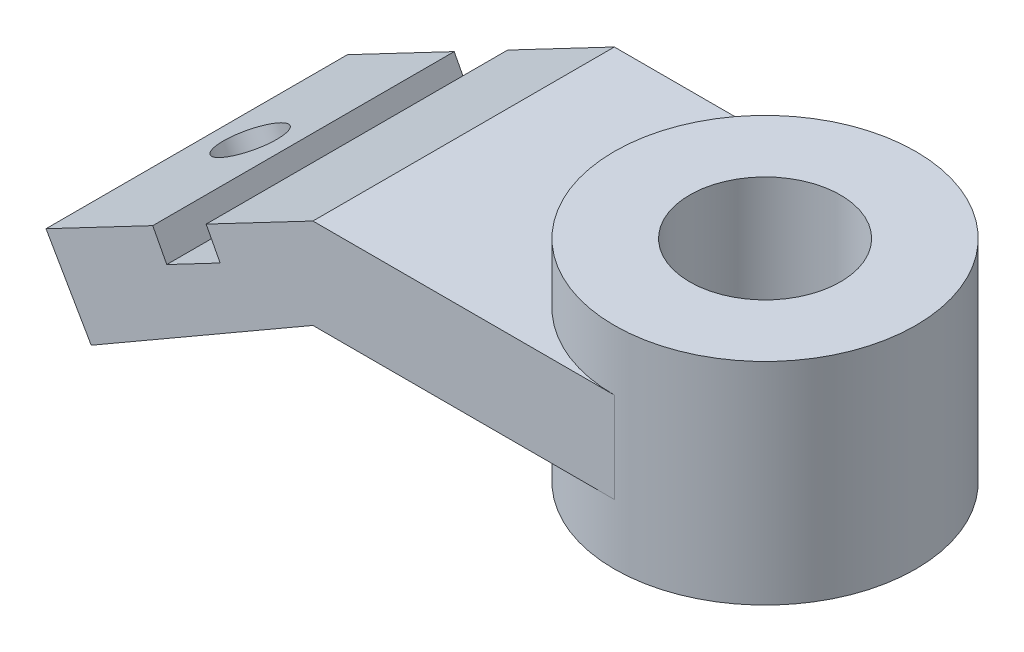
ISO-10303-21;
HEADER;
FILE_DESCRIPTION(('STEP AP214'),'2;1');
FILE_NAME('part.step','',(''),(''),'','','');
FILE_SCHEMA(('AUTOMOTIVE_DESIGN { 1 0 10303 214 1 1 1 1 }'));
ENDSEC;
DATA;
#1=APPLICATION_CONTEXT('core data for automotive mechanical design processes');
#2=APPLICATION_PROTOCOL_DEFINITION('international standard','automotive_design',2000,#1);
#3=PRODUCT_CONTEXT('',#1,'mechanical');
#4=PRODUCT('Part','Part','',(#3));
#5=PRODUCT_RELATED_PRODUCT_CATEGORY('part','',(#4));
#6=PRODUCT_DEFINITION_FORMATION('','',#4);
#7=PRODUCT_DEFINITION_CONTEXT('part definition',#1,'design');
#8=PRODUCT_DEFINITION('design','',#6,#7);
#9=PRODUCT_DEFINITION_SHAPE('','',#8);
#10=(LENGTH_UNIT() NAMED_UNIT(*) SI_UNIT(.MILLI.,.METRE.));
#11=(NAMED_UNIT(*) PLANE_ANGLE_UNIT() SI_UNIT($,.RADIAN.));
#12=(NAMED_UNIT(*) SI_UNIT($,.STERADIAN.) SOLID_ANGLE_UNIT());
#13=UNCERTAINTY_MEASURE_WITH_UNIT(LENGTH_MEASURE(1.E-05),#10,'distance_accuracy_value','');
#14=(GEOMETRIC_REPRESENTATION_CONTEXT(3) GLOBAL_UNCERTAINTY_ASSIGNED_CONTEXT((#13)) GLOBAL_UNIT_ASSIGNED_CONTEXT((#10,
#11,#12)) REPRESENTATION_CONTEXT('',''));
#15=CARTESIAN_POINT('',(0.,0.,0.));
#16=DIRECTION('',(0.,0.,1.));
#17=DIRECTION('',(1.,0.,0.));
#18=AXIS2_PLACEMENT_3D('',#15,#16,#17);
#19=CARTESIAN_POINT('',(-50.,7.5,25.));
#20=DIRECTION('',(0.464788358802753,-0.885421809942269,0.));
#21=DIRECTION('',(0.885421809942269,0.464788358802753,0.));
#22=AXIS2_PLACEMENT_3D('',#19,#20,#21);
#23=PLANE('',#22);
#24=CARTESIAN_POINT('',(-85.4168723976908,-11.0915343521101,0.));
#25=DIRECTION('',(-0.464788358802753,0.885421809942269,0.));
#26=DIRECTION('',(-0.885421809942269,-0.464788358802753,0.));
#27=AXIS2_PLACEMENT_3D('',#24,#25,#26);
#28=CIRCLE('',#27,5.);
#29=CARTESIAN_POINT('',(-89.8439814474021,-13.4154761461239,0.));
#30=VERTEX_POINT('',#29);
#31=EDGE_CURVE('E217',#30,#30,#28,.T.);
#32=ORIENTED_EDGE('',*,*,#31,.F.);
#33=EDGE_LOOP('',(#32));
#34=FACE_BOUND('',#33,.T.);
#35=DIRECTION('',(-0.885421809942269,-0.464788358802753,0.));
#36=VECTOR('',#35,1.);
#37=CARTESIAN_POINT('',(-50.,7.5,25.));
#38=LINE('',#37,#36);
#39=CARTESIAN_POINT('',(-76.5626542982681,-6.4436507640826,25.));
#40=VERTEX_POINT('',#39);
#41=CARTESIAN_POINT('',(-94.2710904971134,-15.7394179401377,25.));
#42=VERTEX_POINT('',#41);
#43=EDGE_CURVE('E145',#40,#42,#38,.T.);
#44=ORIENTED_EDGE('',*,*,#43,.F.);
#45=DIRECTION('',(0.,0.,-1.));
#46=VECTOR('',#45,1.);
#47=CARTESIAN_POINT('',(-76.5626542982681,-6.4436507640826,25.));
#48=LINE('',#47,#46);
#49=CARTESIAN_POINT('',(-76.5626542982681,-6.4436507640826,-25.));
#50=VERTEX_POINT('',#49);
#51=EDGE_CURVE('E42',#40,#50,#48,.T.);
#52=ORIENTED_EDGE('',*,*,#51,.T.);
#53=DIRECTION('',(-0.885421809942269,-0.464788358802753,0.));
#54=VECTOR('',#53,1.);
#55=CARTESIAN_POINT('',(-50.,7.5,-25.));
#56=LINE('',#55,#54);
#57=CARTESIAN_POINT('',(-94.2710904971134,-15.7394179401377,-25.));
#58=VERTEX_POINT('',#57);
#59=EDGE_CURVE('E134',#50,#58,#56,.T.);
#60=ORIENTED_EDGE('',*,*,#59,.T.);
#61=DIRECTION('',(0.,0.,-1.));
#62=VECTOR('',#61,1.);
#63=CARTESIAN_POINT('',(-94.2710904971134,-15.7394179401377,25.));
#64=LINE('',#63,#62);
#65=EDGE_CURVE('E149',#42,#58,#64,.T.);
#66=ORIENTED_EDGE('',*,*,#65,.F.);
#67=EDGE_LOOP('',(#44,#52,#60,#66));
#68=FACE_BOUND('',#67,.T.);
#69=ADVANCED_FACE('F33',(#34,#68),#23,.F.);
#70=CARTESIAN_POINT('',(0.,17.5,0.));
#71=DIRECTION('',(0.,-1.,0.));
#72=DIRECTION('',(0.,0.,-1.));
#73=AXIS2_PLACEMENT_3D('',#70,#71,#72);
#74=CYLINDRICAL_SURFACE('',#73,25.);
#75=CARTESIAN_POINT('',(0.,-17.5,0.));
#76=DIRECTION('',(0.,1.,0.));
#77=DIRECTION('',(0.,0.,1.));
#78=AXIS2_PLACEMENT_3D('',#75,#76,#77);
#79=CIRCLE('',#78,25.);
#80=CARTESIAN_POINT('',(0.,-17.5,25.));
#81=VERTEX_POINT('',#80);
#82=EDGE_CURVE('E177',#81,#81,#79,.T.);
#83=ORIENTED_EDGE('',*,*,#82,.T.);
#84=EDGE_LOOP('',(#83));
#85=FACE_BOUND('',#84,.T.);
#86=CARTESIAN_POINT('',(0.,17.5,0.));
#87=DIRECTION('',(0.,1.,0.));
#88=DIRECTION('',(0.,0.,1.));
#89=AXIS2_PLACEMENT_3D('',#86,#87,#88);
#90=CIRCLE('',#89,25.);
#91=CARTESIAN_POINT('',(0.,17.5,25.));
#92=VERTEX_POINT('',#91);
#93=EDGE_CURVE('E118',#92,#92,#90,.T.);
#94=ORIENTED_EDGE('',*,*,#93,.F.);
#95=EDGE_LOOP('',(#94));
#96=FACE_BOUND('',#95,.T.);
#97=DIRECTION('',(0.,1.,0.));
#98=VECTOR('',#97,1.);
#99=CARTESIAN_POINT('',(0.,-7.5,25.));
#100=LINE('',#99,#98);
#101=CARTESIAN_POINT('',(0.,-7.5,25.));
#102=VERTEX_POINT('',#101);
#103=CARTESIAN_POINT('',(0.,7.5,25.));
#104=VERTEX_POINT('',#103);
#105=EDGE_CURVE('E156',#102,#104,#100,.T.);
#106=ORIENTED_EDGE('',*,*,#105,.F.);
#107=CARTESIAN_POINT('',(0.,-7.5,0.));
#108=DIRECTION('',(0.,1.,0.));
#109=DIRECTION('',(-1.,0.,0.));
#110=AXIS2_PLACEMENT_3D('',#107,#108,#109);
#111=CIRCLE('',#110,25.);
#112=CARTESIAN_POINT('',(0.,-7.5,-25.));
#113=VERTEX_POINT('',#112);
#114=EDGE_CURVE('E169',#113,#102,#111,.T.);
#115=ORIENTED_EDGE('',*,*,#114,.F.);
#116=DIRECTION('',(0.,1.,0.));
#117=VECTOR('',#116,1.);
#118=CARTESIAN_POINT('',(0.,-7.5,-25.));
#119=LINE('',#118,#117);
#120=CARTESIAN_POINT('',(0.,7.5,-25.));
#121=VERTEX_POINT('',#120);
#122=EDGE_CURVE('E152',#113,#121,#119,.T.);
#123=ORIENTED_EDGE('',*,*,#122,.T.);
#124=CARTESIAN_POINT('',(0.,7.5,0.));
#125=DIRECTION('',(0.,-1.,0.));
#126=DIRECTION('',(1.,0.,0.));
#127=AXIS2_PLACEMENT_3D('',#124,#125,#126);
#128=CIRCLE('',#127,25.);
#129=EDGE_CURVE('E57',#104,#121,#128,.T.);
#130=ORIENTED_EDGE('',*,*,#129,.F.);
#131=EDGE_LOOP('',(#106,#115,#123,#130));
#132=FACE_BOUND('',#131,.T.);
#133=ADVANCED_FACE('F35',(#85,#96,#132),#74,.T.);
#134=CARTESIAN_POINT('',(0.,17.5,0.));
#135=DIRECTION('',(0.,-1.,0.));
#136=DIRECTION('',(0.,0.,-1.));
#137=AXIS2_PLACEMENT_3D('',#134,#135,#136);
#138=CYLINDRICAL_SURFACE('',#137,12.5);
#139=CARTESIAN_POINT('',(0.,17.5,0.));
#140=DIRECTION('',(0.,1.,0.));
#141=DIRECTION('',(0.,0.,1.));
#142=AXIS2_PLACEMENT_3D('',#139,#140,#141);
#143=CIRCLE('',#142,12.5);
#144=CARTESIAN_POINT('',(0.,17.5,12.5));
#145=VERTEX_POINT('',#144);
#146=EDGE_CURVE('E174',#145,#145,#143,.T.);
#147=ORIENTED_EDGE('',*,*,#146,.T.);
#148=EDGE_LOOP('',(#147));
#149=FACE_BOUND('',#148,.T.);
#150=CARTESIAN_POINT('',(0.,-17.5,0.));
#151=DIRECTION('',(0.,1.,0.));
#152=DIRECTION('',(0.,0.,1.));
#153=AXIS2_PLACEMENT_3D('',#150,#151,#152);
#154=CIRCLE('',#153,12.5);
#155=CARTESIAN_POINT('',(0.,-17.5,12.5));
#156=VERTEX_POINT('',#155);
#157=EDGE_CURVE('E173',#156,#156,#154,.T.);
#158=ORIENTED_EDGE('',*,*,#157,.F.);
#159=EDGE_LOOP('',(#158));
#160=FACE_BOUND('',#159,.T.);
#161=ADVANCED_FACE('F242',(#149,#160),#138,.F.);
#162=CARTESIAN_POINT('',(0.,17.5,0.));
#163=DIRECTION('',(0.,1.,0.));
#164=DIRECTION('',(0.,0.,1.));
#165=AXIS2_PLACEMENT_3D('',#162,#163,#164);
#166=PLANE('',#165);
#167=ORIENTED_EDGE('',*,*,#93,.T.);
#168=EDGE_LOOP('',(#167));
#169=FACE_BOUND('',#168,.T.);
#170=ORIENTED_EDGE('',*,*,#146,.F.);
#171=EDGE_LOOP('',(#170));
#172=FACE_BOUND('',#171,.T.);
#173=ADVANCED_FACE('F269',(#169,#172),#166,.T.);
#174=CARTESIAN_POINT('',(0.,-17.5,0.));
#175=DIRECTION('',(0.,1.,0.));
#176=DIRECTION('',(0.,0.,1.));
#177=AXIS2_PLACEMENT_3D('',#174,#175,#176);
#178=PLANE('',#177);
#179=ORIENTED_EDGE('',*,*,#82,.F.);
#180=EDGE_LOOP('',(#179));
#181=FACE_BOUND('',#180,.T.);
#182=ORIENTED_EDGE('',*,*,#157,.T.);
#183=EDGE_LOOP('',(#182));
#184=FACE_BOUND('',#183,.T.);
#185=ADVANCED_FACE('F265',(#181,#184),#178,.F.);
#186=CARTESIAN_POINT('',(-15.,7.5,25.));
#187=DIRECTION('',(0.,-1.,0.));
#188=DIRECTION('',(1.,0.,0.));
#189=AXIS2_PLACEMENT_3D('',#186,#187,#188);
#190=PLANE('',#189);
#191=DIRECTION('',(-1.,0.,0.));
#192=VECTOR('',#191,1.);
#193=CARTESIAN_POINT('',(0.,7.5,25.));
#194=LINE('',#193,#192);
#195=CARTESIAN_POINT('',(-50.,7.5,25.));
#196=VERTEX_POINT('',#195);
#197=EDGE_CURVE('E159',#104,#196,#194,.T.);
#198=ORIENTED_EDGE('',*,*,#197,.F.);
#199=ORIENTED_EDGE('',*,*,#129,.T.);
#200=DIRECTION('',(-1.,0.,0.));
#201=VECTOR('',#200,1.);
#202=CARTESIAN_POINT('',(-15.,7.5,-25.));
#203=LINE('',#202,#201);
#204=CARTESIAN_POINT('',(-50.,7.5,-25.));
#205=VERTEX_POINT('',#204);
#206=EDGE_CURVE('E163',#121,#205,#203,.T.);
#207=ORIENTED_EDGE('',*,*,#206,.T.);
#208=DIRECTION('',(0.,0.,-1.));
#209=VECTOR('',#208,1.);
#210=CARTESIAN_POINT('',(-50.,7.5,25.));
#211=LINE('',#210,#209);
#212=EDGE_CURVE('E132',#196,#205,#211,.T.);
#213=ORIENTED_EDGE('',*,*,#212,.F.);
#214=EDGE_LOOP('',(#198,#199,#207,#213));
#215=FACE_BOUND('',#214,.T.);
#216=ADVANCED_FACE('F261',(#215),#190,.F.);
#217=CARTESIAN_POINT('',(-50.,-7.5,25.));
#218=DIRECTION('',(0.,1.,0.));
#219=DIRECTION('',(-1.,0.,0.));
#220=AXIS2_PLACEMENT_3D('',#217,#218,#219);
#221=PLANE('',#220);
#222=DIRECTION('',(1.,0.,0.));
#223=VECTOR('',#222,1.);
#224=CARTESIAN_POINT('',(-50.,-7.5,-25.));
#225=LINE('',#224,#223);
#226=CARTESIAN_POINT('',(-50.,-7.5,-25.));
#227=VERTEX_POINT('',#226);
#228=EDGE_CURVE('E157',#227,#113,#225,.T.);
#229=ORIENTED_EDGE('',*,*,#228,.T.);
#230=ORIENTED_EDGE('',*,*,#114,.T.);
#231=DIRECTION('',(1.,0.,0.));
#232=VECTOR('',#231,1.);
#233=CARTESIAN_POINT('',(-15.,-7.5,25.));
#234=LINE('',#233,#232);
#235=CARTESIAN_POINT('',(-50.,-7.5,25.));
#236=VERTEX_POINT('',#235);
#237=EDGE_CURVE('E153',#236,#102,#234,.T.);
#238=ORIENTED_EDGE('',*,*,#237,.F.);
#239=DIRECTION('',(0.,0.,-1.));
#240=VECTOR('',#239,1.);
#241=CARTESIAN_POINT('',(-50.,-7.5,25.));
#242=LINE('',#241,#240);
#243=EDGE_CURVE('E161',#236,#227,#242,.T.);
#244=ORIENTED_EDGE('',*,*,#243,.T.);
#245=EDGE_LOOP('',(#229,#230,#238,#244));
#246=FACE_BOUND('',#245,.T.);
#247=ADVANCED_FACE('F257',(#246),#221,.F.);
#248=CARTESIAN_POINT('',(0.,0.,25.));
#249=DIRECTION('',(0.,0.,1.));
#250=DIRECTION('',(1.,0.,0.));
#251=AXIS2_PLACEMENT_3D('',#248,#249,#250);
#252=PLANE('',#251);
#253=DIRECTION('',(0.464788358802753,-0.885421809942269,0.));
#254=VECTOR('',#253,1.);
#255=CARTESIAN_POINT('',(-62.674740250156,-32.900126620055,25.));
#256=LINE('',#255,#254);
#257=CARTESIAN_POINT('',(-74.2387125042543,-10.8707598137939,25.));
#258=VERTEX_POINT('',#257);
#259=EDGE_CURVE('E209',#40,#258,#256,.T.);
#260=ORIENTED_EDGE('',*,*,#259,.F.);
#261=ORIENTED_EDGE('',*,*,#43,.T.);
#262=DIRECTION('',(0.499999999999995,-0.866025403784442,0.));
#263=VECTOR('',#262,1.);
#264=CARTESIAN_POINT('',(-94.2710904971134,-15.7394179401377,25.));
#265=LINE('',#264,#263);
#266=CARTESIAN_POINT('',(-86.7710904971135,-28.7297989969043,25.));
#267=VERTEX_POINT('',#266);
#268=EDGE_CURVE('E204',#42,#267,#265,.T.);
#269=ORIENTED_EDGE('',*,*,#268,.T.);
#270=DIRECTION('',(0.866025403784442,0.499999999999995,0.));
#271=VECTOR('',#270,1.);
#272=CARTESIAN_POINT('',(-50.,-7.5,25.));
#273=LINE('',#272,#271);
#274=EDGE_CURVE('E140',#267,#236,#273,.T.);
#275=ORIENTED_EDGE('',*,*,#274,.T.);
#276=ORIENTED_EDGE('',*,*,#237,.T.);
#277=ORIENTED_EDGE('',*,*,#105,.T.);
#278=ORIENTED_EDGE('',*,*,#197,.T.);
#279=CARTESIAN_POINT('',(-67.7084361988454,-1.79576717605508,25.));
#280=VERTEX_POINT('',#279);
#281=EDGE_CURVE('E205',#196,#280,#38,.T.);
#282=ORIENTED_EDGE('',*,*,#281,.T.);
#283=DIRECTION('',(-0.464788358802753,0.885421809942269,0.));
#284=VECTOR('',#283,1.);
#285=CARTESIAN_POINT('',(-53.8205221507333,-28.2522430320274,25.));
#286=LINE('',#285,#284);
#287=CARTESIAN_POINT('',(-65.3844944048316,-6.22287622576641,25.));
#288=VERTEX_POINT('',#287);
#289=EDGE_CURVE('E49',#288,#280,#286,.T.);
#290=ORIENTED_EDGE('',*,*,#289,.F.);
#291=DIRECTION('',(0.885421809942269,0.464788358802754,0.));
#292=VECTOR('',#291,1.);
#293=CARTESIAN_POINT('',(-11.5639722540983,22.029366806261,25.));
#294=LINE('',#293,#292);
#295=EDGE_CURVE('E138',#258,#288,#294,.T.);
#296=ORIENTED_EDGE('',*,*,#295,.F.);
#297=EDGE_LOOP('',(#260,#261,#269,#275,#276,#277,#278,#282,#290,#296));
#298=FACE_BOUND('',#297,.T.);
#299=ADVANCED_FACE('F252',(#298),#252,.T.);
#300=CARTESIAN_POINT('',(0.,0.,-25.));
#301=DIRECTION('',(0.,0.,1.));
#302=DIRECTION('',(1.,0.,0.));
#303=AXIS2_PLACEMENT_3D('',#300,#301,#302);
#304=PLANE('',#303);
#305=ORIENTED_EDGE('',*,*,#59,.F.);
#306=DIRECTION('',(0.464788358802753,-0.885421809942269,0.));
#307=VECTOR('',#306,1.);
#308=CARTESIAN_POINT('',(-62.674740250156,-32.900126620055,-25.));
#309=LINE('',#308,#307);
#310=CARTESIAN_POINT('',(-74.2387125042543,-10.8707598137939,-25.));
#311=VERTEX_POINT('',#310);
#312=EDGE_CURVE('E191',#50,#311,#309,.T.);
#313=ORIENTED_EDGE('',*,*,#312,.T.);
#314=DIRECTION('',(0.885421809942269,0.464788358802754,0.));
#315=VECTOR('',#314,1.);
#316=CARTESIAN_POINT('',(-11.5639722540983,22.029366806261,-25.));
#317=LINE('',#316,#315);
#318=CARTESIAN_POINT('',(-65.3844944048316,-6.22287622576641,-25.));
#319=VERTEX_POINT('',#318);
#320=EDGE_CURVE('E11',#311,#319,#317,.T.);
#321=ORIENTED_EDGE('',*,*,#320,.T.);
#322=DIRECTION('',(-0.464788358802753,0.885421809942269,0.));
#323=VECTOR('',#322,1.);
#324=CARTESIAN_POINT('',(-53.8205221507333,-28.2522430320274,-25.));
#325=LINE('',#324,#323);
#326=CARTESIAN_POINT('',(-67.7084361988454,-1.79576717605507,-25.));
#327=VERTEX_POINT('',#326);
#328=EDGE_CURVE('E112',#319,#327,#325,.T.);
#329=ORIENTED_EDGE('',*,*,#328,.T.);
#330=EDGE_CURVE('E125',#205,#327,#56,.T.);
#331=ORIENTED_EDGE('',*,*,#330,.F.);
#332=ORIENTED_EDGE('',*,*,#206,.F.);
#333=ORIENTED_EDGE('',*,*,#122,.F.);
#334=ORIENTED_EDGE('',*,*,#228,.F.);
#335=DIRECTION('',(0.866025403784442,0.499999999999995,0.));
#336=VECTOR('',#335,1.);
#337=CARTESIAN_POINT('',(-50.,-7.5,-25.));
#338=LINE('',#337,#336);
#339=CARTESIAN_POINT('',(-86.7710904971135,-28.7297989969043,-25.));
#340=VERTEX_POINT('',#339);
#341=EDGE_CURVE('E136',#340,#227,#338,.T.);
#342=ORIENTED_EDGE('',*,*,#341,.F.);
#343=DIRECTION('',(0.499999999999995,-0.866025403784442,0.));
#344=VECTOR('',#343,1.);
#345=CARTESIAN_POINT('',(-94.2710904971134,-15.7394179401377,-25.));
#346=LINE('',#345,#344);
#347=EDGE_CURVE('E133',#58,#340,#346,.T.);
#348=ORIENTED_EDGE('',*,*,#347,.F.);
#349=EDGE_LOOP('',(#305,#313,#321,#329,#331,#332,#333,#334,#342,#348));
#350=FACE_BOUND('',#349,.T.);
#351=ADVANCED_FACE('F123',(#350),#304,.F.);
#352=ORIENTED_EDGE('',*,*,#330,.T.);
#353=DIRECTION('',(0.,0.,1.));
#354=VECTOR('',#353,1.);
#355=CARTESIAN_POINT('',(-67.7084361988454,-1.79576717605507,25.));
#356=LINE('',#355,#354);
#357=EDGE_CURVE('E109',#327,#280,#356,.T.);
#358=ORIENTED_EDGE('',*,*,#357,.T.);
#359=ORIENTED_EDGE('',*,*,#281,.F.);
#360=ORIENTED_EDGE('',*,*,#212,.T.);
#361=EDGE_LOOP('',(#352,#358,#359,#360));
#362=FACE_BOUND('',#361,.T.);
#363=ADVANCED_FACE('F130',(#362),#23,.F.);
#364=CARTESIAN_POINT('',(-94.2710904971134,-15.7394179401377,25.));
#365=DIRECTION('',(0.866025403784442,0.499999999999995,0.));
#366=DIRECTION('',(-0.499999999999995,0.866025403784442,0.));
#367=AXIS2_PLACEMENT_3D('',#364,#365,#366);
#368=PLANE('',#367);
#369=ORIENTED_EDGE('',*,*,#347,.T.);
#370=DIRECTION('',(0.,0.,-1.));
#371=VECTOR('',#370,1.);
#372=CARTESIAN_POINT('',(-86.7710904971135,-28.7297989969043,25.));
#373=LINE('',#372,#371);
#374=EDGE_CURVE('E146',#267,#340,#373,.T.);
#375=ORIENTED_EDGE('',*,*,#374,.F.);
#376=ORIENTED_EDGE('',*,*,#268,.F.);
#377=ORIENTED_EDGE('',*,*,#65,.T.);
#378=EDGE_LOOP('',(#369,#375,#376,#377));
#379=FACE_BOUND('',#378,.T.);
#380=ADVANCED_FACE('F196',(#379),#368,.F.);
#381=CARTESIAN_POINT('',(-50.,-7.5,25.));
#382=DIRECTION('',(-0.499999999999995,0.866025403784441,0.));
#383=DIRECTION('',(-0.866025403784442,-0.499999999999995,0.));
#384=AXIS2_PLACEMENT_3D('',#381,#382,#383);
#385=PLANE('',#384);
#386=CARTESIAN_POINT('',(-78.6263695149481,-24.0274421453768,0.));
#387=DIRECTION('',(-0.499999999999995,0.866025403784441,0.));
#388=DIRECTION('',(0.866025403784442,0.499999999999995,0.));
#389=AXIS2_PLACEMENT_3D('',#386,#387,#388);
#390=ELLIPSE('',#389,5.00404346790342,5.);
#391=CARTESIAN_POINT('',(-74.2927407501022,-21.5254204114251,0.));
#392=VERTEX_POINT('',#391);
#393=EDGE_CURVE('E37',#392,#392,#390,.T.);
#394=ORIENTED_EDGE('',*,*,#393,.T.);
#395=EDGE_LOOP('',(#394));
#396=FACE_BOUND('',#395,.T.);
#397=ORIENTED_EDGE('',*,*,#341,.T.);
#398=ORIENTED_EDGE('',*,*,#243,.F.);
#399=ORIENTED_EDGE('',*,*,#274,.F.);
#400=ORIENTED_EDGE('',*,*,#374,.T.);
#401=EDGE_LOOP('',(#397,#398,#399,#400));
#402=FACE_BOUND('',#401,.T.);
#403=ADVANCED_FACE('F200',(#396,#402),#385,.F.);
#404=CARTESIAN_POINT('',(-11.5639722540983,22.029366806261,0.));
#405=DIRECTION('',(0.464788358802754,-0.885421809942269,0.));
#406=DIRECTION('',(0.885421809942269,0.464788358802754,0.));
#407=AXIS2_PLACEMENT_3D('',#404,#405,#406);
#408=PLANE('',#407);
#409=ORIENTED_EDGE('',*,*,#295,.T.);
#410=DIRECTION('',(0.,0.,-1.));
#411=VECTOR('',#410,1.);
#412=CARTESIAN_POINT('',(-65.3844944048316,-6.22287622576641,-37.9890992136893));
#413=LINE('',#412,#411);
#414=EDGE_CURVE('E128',#288,#319,#413,.T.);
#415=ORIENTED_EDGE('',*,*,#414,.T.);
#416=ORIENTED_EDGE('',*,*,#320,.F.);
#417=DIRECTION('',(0.,0.,1.));
#418=VECTOR('',#417,1.);
#419=CARTESIAN_POINT('',(-74.2387125042543,-10.8707598137939,-37.9890992136893));
#420=LINE('',#419,#418);
#421=EDGE_CURVE('E214',#311,#258,#420,.T.);
#422=ORIENTED_EDGE('',*,*,#421,.T.);
#423=EDGE_LOOP('',(#409,#415,#416,#422));
#424=FACE_BOUND('',#423,.T.);
#425=ADVANCED_FACE('F289',(#424),#408,.F.);
#426=CARTESIAN_POINT('',(-74.2387125042543,-10.8707598137939,-37.9890992136893));
#427=DIRECTION('',(-0.885421809942269,-0.464788358802753,0.));
#428=DIRECTION('',(0.464788358802753,-0.885421809942269,0.));
#429=AXIS2_PLACEMENT_3D('',#426,#427,#428);
#430=PLANE('',#429);
#431=ORIENTED_EDGE('',*,*,#259,.T.);
#432=ORIENTED_EDGE('',*,*,#421,.F.);
#433=ORIENTED_EDGE('',*,*,#312,.F.);
#434=ORIENTED_EDGE('',*,*,#51,.F.);
#435=EDGE_LOOP('',(#431,#432,#433,#434));
#436=FACE_BOUND('',#435,.T.);
#437=ADVANCED_FACE('F231',(#436),#430,.F.);
#438=CARTESIAN_POINT('',(-65.3844944048316,-6.22287622576641,-37.9890992136893));
#439=DIRECTION('',(0.885421809942269,0.464788358802753,0.));
#440=DIRECTION('',(-0.464788358802753,0.885421809942269,0.));
#441=AXIS2_PLACEMENT_3D('',#438,#439,#440);
#442=PLANE('',#441);
#443=ORIENTED_EDGE('',*,*,#289,.T.);
#444=ORIENTED_EDGE('',*,*,#357,.F.);
#445=ORIENTED_EDGE('',*,*,#328,.F.);
#446=ORIENTED_EDGE('',*,*,#414,.F.);
#447=EDGE_LOOP('',(#443,#444,#445,#446));
#448=FACE_BOUND('',#447,.T.);
#449=ADVANCED_FACE('F111',(#448),#442,.F.);
#450=CARTESIAN_POINT('',(-54.3049709727974,-70.3597056577193,0.));
#451=DIRECTION('',(-0.464788358802753,0.885421809942269,0.));
#452=DIRECTION('',(-0.885421809942269,-0.464788358802753,0.));
#453=AXIS2_PLACEMENT_3D('',#450,#451,#452);
#454=CYLINDRICAL_SURFACE('',#453,5.);
#455=ORIENTED_EDGE('',*,*,#31,.T.);
#456=EDGE_LOOP('',(#455));
#457=FACE_BOUND('',#456,.T.);
#458=ORIENTED_EDGE('',*,*,#393,.F.);
#459=EDGE_LOOP('',(#458));
#460=FACE_BOUND('',#459,.T.);
#461=ADVANCED_FACE('F225',(#457,#460),#454,.F.);
#462=CLOSED_SHELL('',(#69,#133,#161,#173,#185,#216,#247,#299,#351,#363,#380,#403,#425,#437,#449,#461));
#463=MANIFOLD_SOLID_BREP('B2',#462);
#464=ADVANCED_BREP_SHAPE_REPRESENTATION('',(#18,#463),#14);
#465=SHAPE_DEFINITION_REPRESENTATION(#9,#464);
ENDSEC;
END-ISO-10303-21;
